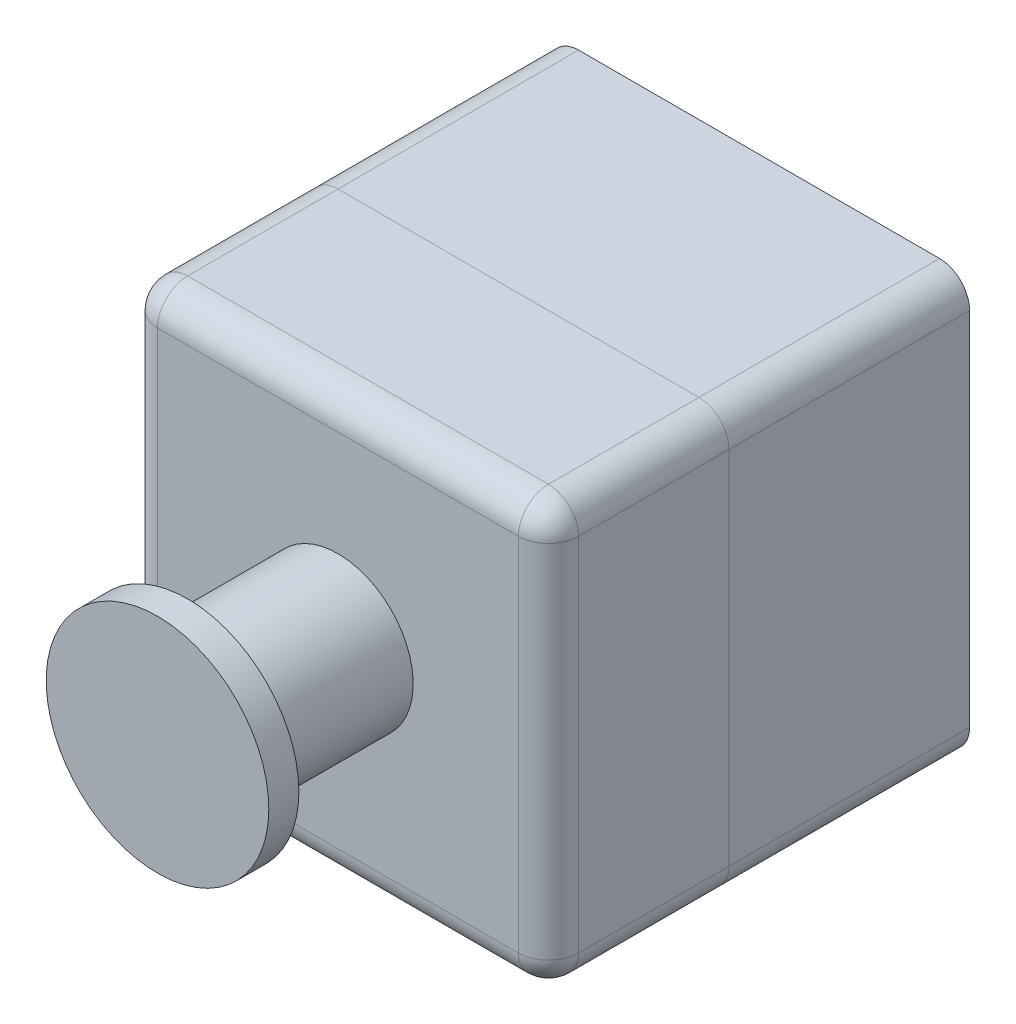
ISO-10303-21;
HEADER;
FILE_DESCRIPTION(('STEP AP214'),'2;1');
FILE_NAME('part.step','',(''),(''),'','','');
FILE_SCHEMA(('AUTOMOTIVE_DESIGN { 1 0 10303 214 1 1 1 1 }'));
ENDSEC;
DATA;
#1=APPLICATION_CONTEXT('core data for automotive mechanical design processes');
#2=APPLICATION_PROTOCOL_DEFINITION('international standard','automotive_design',2000,#1);
#3=PRODUCT_CONTEXT('',#1,'mechanical');
#4=PRODUCT('Part','Part','',(#3));
#5=PRODUCT_RELATED_PRODUCT_CATEGORY('part','',(#4));
#6=PRODUCT_DEFINITION_FORMATION('','',#4);
#7=PRODUCT_DEFINITION_CONTEXT('part definition',#1,'design');
#8=PRODUCT_DEFINITION('design','',#6,#7);
#9=PRODUCT_DEFINITION_SHAPE('','',#8);
#10=(LENGTH_UNIT() NAMED_UNIT(*) SI_UNIT(.MILLI.,.METRE.));
#11=(NAMED_UNIT(*) PLANE_ANGLE_UNIT() SI_UNIT($,.RADIAN.));
#12=(NAMED_UNIT(*) SI_UNIT($,.STERADIAN.) SOLID_ANGLE_UNIT());
#13=UNCERTAINTY_MEASURE_WITH_UNIT(LENGTH_MEASURE(1.E-05),#10,'distance_accuracy_value','');
#14=(GEOMETRIC_REPRESENTATION_CONTEXT(3) GLOBAL_UNCERTAINTY_ASSIGNED_CONTEXT((#13)) GLOBAL_UNIT_ASSIGNED_CONTEXT((#10,
#11,#12)) REPRESENTATION_CONTEXT('',''));
#15=CARTESIAN_POINT('',(0.,0.,0.));
#16=DIRECTION('',(0.,0.,1.));
#17=DIRECTION('',(1.,0.,0.));
#18=AXIS2_PLACEMENT_3D('',#15,#16,#17);
#19=CARTESIAN_POINT('',(35.,-35.,40.));
#20=DIRECTION('',(-1.,0.,0.));
#21=DIRECTION('',(0.,0.,1.));
#22=AXIS2_PLACEMENT_3D('',#19,#20,#21);
#23=PLANE('',#22);
#24=DIRECTION('',(0.,1.,0.));
#25=VECTOR('',#24,1.);
#26=CARTESIAN_POINT('',(35.,-35.,0.));
#27=LINE('',#26,#25);
#28=CARTESIAN_POINT('',(35.,-30.,0.));
#29=VERTEX_POINT('',#28);
#30=CARTESIAN_POINT('',(35.,30.,0.));
#31=VERTEX_POINT('',#30);
#32=EDGE_CURVE('E261',#29,#31,#27,.T.);
#33=ORIENTED_EDGE('',*,*,#32,.T.);
#34=DIRECTION('',(0.,0.,-1.));
#35=VECTOR('',#34,1.);
#36=CARTESIAN_POINT('',(35.,30.,40.));
#37=LINE('',#36,#35);
#38=CARTESIAN_POINT('',(34.9975,29.9975,40.));
#39=VERTEX_POINT('',#38);
#40=EDGE_CURVE('E470',#31,#39,#37,.F.);
#41=ORIENTED_EDGE('',*,*,#40,.T.);
#42=CARTESIAN_POINT('',(34.995,-29.9975,40.));
#43=DIRECTION('',(0.,1.,0.));
#44=VECTOR('',#43,1.);
#45=LINE('',#42,#44);
#46=CARTESIAN_POINT('',(34.9975,-29.9975,40.));
#47=VERTEX_POINT('',#46);
#48=EDGE_CURVE('E231',#47,#39,#45,.T.);
#49=ORIENTED_EDGE('',*,*,#48,.F.);
#50=DIRECTION('',(0.,0.,-1.));
#51=VECTOR('',#50,1.);
#52=CARTESIAN_POINT('',(35.,-30.,40.));
#53=LINE('',#52,#51);
#54=EDGE_CURVE('E432',#47,#29,#53,.T.);
#55=ORIENTED_EDGE('',*,*,#54,.T.);
#56=EDGE_LOOP('',(#33,#41,#49,#55));
#57=FACE_BOUND('',#56,.T.);
#58=ADVANCED_FACE('F35',(#57),#23,.F.);
#59=CARTESIAN_POINT('',(-35.,35.,40.));
#60=DIRECTION('',(0.,-1.,0.));
#61=DIRECTION('',(0.,0.,-1.));
#62=AXIS2_PLACEMENT_3D('',#59,#60,#61);
#63=PLANE('',#62);
#64=DIRECTION('',(-1.,0.,0.));
#65=VECTOR('',#64,1.);
#66=CARTESIAN_POINT('',(-35.,35.,0.));
#67=LINE('',#66,#65);
#68=CARTESIAN_POINT('',(30.,35.,0.));
#69=VERTEX_POINT('',#68);
#70=CARTESIAN_POINT('',(-30.,35.,0.));
#71=VERTEX_POINT('',#70);
#72=EDGE_CURVE('E485',#69,#71,#67,.T.);
#73=ORIENTED_EDGE('',*,*,#72,.T.);
#74=DIRECTION('',(0.,0.,-1.));
#75=VECTOR('',#74,1.);
#76=CARTESIAN_POINT('',(-30.,35.,40.));
#77=LINE('',#76,#75);
#78=CARTESIAN_POINT('',(-29.9975,34.9975,40.));
#79=VERTEX_POINT('',#78);
#80=EDGE_CURVE('E463',#71,#79,#77,.F.);
#81=ORIENTED_EDGE('',*,*,#80,.T.);
#82=CARTESIAN_POINT('',(29.9975,34.995,40.));
#83=DIRECTION('',(-1.,0.,0.));
#84=VECTOR('',#83,1.);
#85=LINE('',#82,#84);
#86=CARTESIAN_POINT('',(29.9975,34.9975,40.));
#87=VERTEX_POINT('',#86);
#88=EDGE_CURVE('E179',#87,#79,#85,.T.);
#89=ORIENTED_EDGE('',*,*,#88,.F.);
#90=DIRECTION('',(0.,0.,-1.));
#91=VECTOR('',#90,1.);
#92=CARTESIAN_POINT('',(30.,35.,40.));
#93=LINE('',#92,#91);
#94=EDGE_CURVE('E58',#87,#69,#93,.T.);
#95=ORIENTED_EDGE('',*,*,#94,.T.);
#96=EDGE_LOOP('',(#73,#81,#89,#95));
#97=FACE_BOUND('',#96,.T.);
#98=ADVANCED_FACE('F204',(#97),#63,.F.);
#99=CARTESIAN_POINT('',(-35.,-35.,40.));
#100=DIRECTION('',(1.,0.,0.));
#101=DIRECTION('',(0.,0.,-1.));
#102=AXIS2_PLACEMENT_3D('',#99,#100,#101);
#103=PLANE('',#102);
#104=CARTESIAN_POINT('',(-34.995,29.9975,40.));
#105=DIRECTION('',(0.,-1.,0.));
#106=VECTOR('',#105,1.);
#107=LINE('',#104,#106);
#108=CARTESIAN_POINT('',(-34.9975,29.9975,40.));
#109=VERTEX_POINT('',#108);
#110=CARTESIAN_POINT('',(-34.9975,-29.9975,40.));
#111=VERTEX_POINT('',#110);
#112=EDGE_CURVE('E166',#109,#111,#107,.T.);
#113=ORIENTED_EDGE('',*,*,#112,.F.);
#114=DIRECTION('',(0.,0.,-1.));
#115=VECTOR('',#114,1.);
#116=CARTESIAN_POINT('',(-35.,30.,40.));
#117=LINE('',#116,#115);
#118=CARTESIAN_POINT('',(-35.,30.,0.));
#119=VERTEX_POINT('',#118);
#120=EDGE_CURVE('E155',#109,#119,#117,.T.);
#121=ORIENTED_EDGE('',*,*,#120,.T.);
#122=DIRECTION('',(0.,-1.,0.));
#123=VECTOR('',#122,1.);
#124=CARTESIAN_POINT('',(-35.,-35.,0.));
#125=LINE('',#124,#123);
#126=CARTESIAN_POINT('',(-35.,-30.,0.));
#127=VERTEX_POINT('',#126);
#128=EDGE_CURVE('E484',#119,#127,#125,.T.);
#129=ORIENTED_EDGE('',*,*,#128,.T.);
#130=DIRECTION('',(0.,0.,-1.));
#131=VECTOR('',#130,1.);
#132=CARTESIAN_POINT('',(-35.,-30.,40.));
#133=LINE('',#132,#131);
#134=EDGE_CURVE('E161',#127,#111,#133,.F.);
#135=ORIENTED_EDGE('',*,*,#134,.T.);
#136=EDGE_LOOP('',(#113,#121,#129,#135));
#137=FACE_BOUND('',#136,.T.);
#138=ADVANCED_FACE('F176',(#137),#103,.F.);
#139=CARTESIAN_POINT('',(-35.,-35.,40.));
#140=DIRECTION('',(0.,1.,0.));
#141=DIRECTION('',(0.,0.,1.));
#142=AXIS2_PLACEMENT_3D('',#139,#140,#141);
#143=PLANE('',#142);
#144=DIRECTION('',(1.,0.,0.));
#145=VECTOR('',#144,1.);
#146=CARTESIAN_POINT('',(-35.,-35.,0.));
#147=LINE('',#146,#145);
#148=CARTESIAN_POINT('',(-30.,-35.,0.));
#149=VERTEX_POINT('',#148);
#150=CARTESIAN_POINT('',(30.,-35.,0.));
#151=VERTEX_POINT('',#150);
#152=EDGE_CURVE('E219',#149,#151,#147,.T.);
#153=ORIENTED_EDGE('',*,*,#152,.T.);
#154=DIRECTION('',(0.,0.,-1.));
#155=VECTOR('',#154,1.);
#156=CARTESIAN_POINT('',(30.,-35.,40.));
#157=LINE('',#156,#155);
#158=CARTESIAN_POINT('',(29.9975,-34.9975,40.));
#159=VERTEX_POINT('',#158);
#160=EDGE_CURVE('E44',#151,#159,#157,.F.);
#161=ORIENTED_EDGE('',*,*,#160,.T.);
#162=CARTESIAN_POINT('',(-29.9975,-34.995,40.));
#163=DIRECTION('',(1.,0.,0.));
#164=VECTOR('',#163,1.);
#165=LINE('',#162,#164);
#166=CARTESIAN_POINT('',(-29.9975,-34.9975,40.));
#167=VERTEX_POINT('',#166);
#168=EDGE_CURVE('E178',#167,#159,#165,.T.);
#169=ORIENTED_EDGE('',*,*,#168,.F.);
#170=DIRECTION('',(0.,0.,-1.));
#171=VECTOR('',#170,1.);
#172=CARTESIAN_POINT('',(-30.,-35.,40.));
#173=LINE('',#172,#171);
#174=EDGE_CURVE('E474',#167,#149,#173,.T.);
#175=ORIENTED_EDGE('',*,*,#174,.T.);
#176=EDGE_LOOP('',(#153,#161,#169,#175));
#177=FACE_BOUND('',#176,.T.);
#178=ADVANCED_FACE('F203',(#177),#143,.F.);
#179=CARTESIAN_POINT('',(0.,0.,0.));
#180=DIRECTION('',(0.,0.,-1.));
#181=DIRECTION('',(-1.,0.,0.));
#182=AXIS2_PLACEMENT_3D('',#179,#180,#181);
#183=PLANE('',#182);
#184=ORIENTED_EDGE('',*,*,#128,.F.);
#185=CARTESIAN_POINT('',(-30.,30.,0.));
#186=DIRECTION('',(0.,0.,-1.));
#187=DIRECTION('',(-1.,0.,0.));
#188=AXIS2_PLACEMENT_3D('',#185,#186,#187);
#189=CIRCLE('',#188,5.);
#190=EDGE_CURVE('E51',#119,#71,#189,.T.);
#191=ORIENTED_EDGE('',*,*,#190,.T.);
#192=ORIENTED_EDGE('',*,*,#72,.F.);
#193=CARTESIAN_POINT('',(30.,30.,0.));
#194=DIRECTION('',(0.,0.,-1.));
#195=DIRECTION('',(-1.,0.,0.));
#196=AXIS2_PLACEMENT_3D('',#193,#194,#195);
#197=CIRCLE('',#196,5.);
#198=EDGE_CURVE('E459',#69,#31,#197,.T.);
#199=ORIENTED_EDGE('',*,*,#198,.T.);
#200=ORIENTED_EDGE('',*,*,#32,.F.);
#201=CARTESIAN_POINT('',(30.,-30.,0.));
#202=DIRECTION('',(0.,0.,-1.));
#203=DIRECTION('',(-1.,0.,0.));
#204=AXIS2_PLACEMENT_3D('',#201,#202,#203);
#205=CIRCLE('',#204,5.);
#206=EDGE_CURVE('E457',#29,#151,#205,.T.);
#207=ORIENTED_EDGE('',*,*,#206,.T.);
#208=ORIENTED_EDGE('',*,*,#152,.F.);
#209=CARTESIAN_POINT('',(-30.,-30.,0.));
#210=DIRECTION('',(0.,0.,-1.));
#211=DIRECTION('',(-1.,0.,0.));
#212=AXIS2_PLACEMENT_3D('',#209,#210,#211);
#213=CIRCLE('',#212,5.);
#214=EDGE_CURVE('E160',#149,#127,#213,.T.);
#215=ORIENTED_EDGE('',*,*,#214,.T.);
#216=EDGE_LOOP('',(#184,#191,#192,#199,#200,#207,#208,#215));
#217=FACE_BOUND('',#216,.T.);
#218=ADVANCED_FACE('F489',(#217),#183,.T.);
#219=CARTESIAN_POINT('',(34.995,-34.995,70.));
#220=DIRECTION('',(-1.,0.,0.));
#221=DIRECTION('',(0.,0.,1.));
#222=AXIS2_PLACEMENT_3D('',#219,#220,#221);
#223=PLANE('',#222);
#224=ORIENTED_EDGE('',*,*,#48,.T.);
#225=DIRECTION('',(0.,0.,-1.));
#226=VECTOR('',#225,1.);
#227=CARTESIAN_POINT('',(34.995,29.995,70.));
#228=LINE('',#227,#226);
#229=CARTESIAN_POINT('',(34.995,29.995,65.));
#230=VERTEX_POINT('',#229);
#231=EDGE_CURVE('E239',#39,#230,#228,.F.);
#232=ORIENTED_EDGE('',*,*,#231,.T.);
#233=DIRECTION('',(0.,1.,0.));
#234=VECTOR('',#233,1.);
#235=CARTESIAN_POINT('',(34.995,-34.995,65.));
#236=LINE('',#235,#234);
#237=CARTESIAN_POINT('',(34.995,-29.995,65.));
#238=VERTEX_POINT('',#237);
#239=EDGE_CURVE('E235',#230,#238,#236,.F.);
#240=ORIENTED_EDGE('',*,*,#239,.T.);
#241=DIRECTION('',(0.,0.,-1.));
#242=VECTOR('',#241,1.);
#243=CARTESIAN_POINT('',(34.995,-29.995,70.));
#244=LINE('',#243,#242);
#245=EDGE_CURVE('E237',#238,#47,#244,.T.);
#246=ORIENTED_EDGE('',*,*,#245,.T.);
#247=EDGE_LOOP('',(#224,#232,#240,#246));
#248=FACE_BOUND('',#247,.T.);
#249=ADVANCED_FACE('F281',(#248),#223,.F.);
#250=CARTESIAN_POINT('',(-34.995,34.995,70.));
#251=DIRECTION('',(0.,-1.,0.));
#252=DIRECTION('',(0.,0.,-1.));
#253=AXIS2_PLACEMENT_3D('',#250,#251,#252);
#254=PLANE('',#253);
#255=ORIENTED_EDGE('',*,*,#88,.T.);
#256=DIRECTION('',(0.,0.,-1.));
#257=VECTOR('',#256,1.);
#258=CARTESIAN_POINT('',(-29.995,34.995,70.));
#259=LINE('',#258,#257);
#260=CARTESIAN_POINT('',(-29.995,34.995,65.));
#261=VERTEX_POINT('',#260);
#262=EDGE_CURVE('E147',#79,#261,#259,.F.);
#263=ORIENTED_EDGE('',*,*,#262,.T.);
#264=DIRECTION('',(-1.,0.,0.));
#265=VECTOR('',#264,1.);
#266=CARTESIAN_POINT('',(-34.995,34.995,65.));
#267=LINE('',#266,#265);
#268=CARTESIAN_POINT('',(29.995,34.995,65.));
#269=VERTEX_POINT('',#268);
#270=EDGE_CURVE('E172',#261,#269,#267,.F.);
#271=ORIENTED_EDGE('',*,*,#270,.T.);
#272=DIRECTION('',(0.,0.,-1.));
#273=VECTOR('',#272,1.);
#274=CARTESIAN_POINT('',(29.995,34.995,70.));
#275=LINE('',#274,#273);
#276=EDGE_CURVE('E301',#269,#87,#275,.T.);
#277=ORIENTED_EDGE('',*,*,#276,.T.);
#278=EDGE_LOOP('',(#255,#263,#271,#277));
#279=FACE_BOUND('',#278,.T.);
#280=ADVANCED_FACE('F277',(#279),#254,.F.);
#281=CARTESIAN_POINT('',(-34.995,-34.995,70.));
#282=DIRECTION('',(1.,0.,0.));
#283=DIRECTION('',(0.,0.,-1.));
#284=AXIS2_PLACEMENT_3D('',#281,#282,#283);
#285=PLANE('',#284);
#286=DIRECTION('',(0.,-1.,0.));
#287=VECTOR('',#286,1.);
#288=CARTESIAN_POINT('',(-34.995,-34.995,65.));
#289=LINE('',#288,#287);
#290=CARTESIAN_POINT('',(-34.995,-29.995,65.));
#291=VERTEX_POINT('',#290);
#292=CARTESIAN_POINT('',(-34.995,29.995,65.));
#293=VERTEX_POINT('',#292);
#294=EDGE_CURVE('E170',#291,#293,#289,.F.);
#295=ORIENTED_EDGE('',*,*,#294,.T.);
#296=DIRECTION('',(0.,0.,-1.));
#297=VECTOR('',#296,1.);
#298=CARTESIAN_POINT('',(-34.995,29.995,70.));
#299=LINE('',#298,#297);
#300=EDGE_CURVE('E146',#293,#109,#299,.T.);
#301=ORIENTED_EDGE('',*,*,#300,.T.);
#302=ORIENTED_EDGE('',*,*,#112,.T.);
#303=DIRECTION('',(0.,0.,-1.));
#304=VECTOR('',#303,1.);
#305=CARTESIAN_POINT('',(-34.995,-29.995,70.));
#306=LINE('',#305,#304);
#307=EDGE_CURVE('E173',#111,#291,#306,.F.);
#308=ORIENTED_EDGE('',*,*,#307,.T.);
#309=EDGE_LOOP('',(#295,#301,#302,#308));
#310=FACE_BOUND('',#309,.T.);
#311=ADVANCED_FACE('F165',(#310),#285,.F.);
#312=CARTESIAN_POINT('',(-34.995,-34.995,70.));
#313=DIRECTION('',(0.,1.,0.));
#314=DIRECTION('',(0.,0.,1.));
#315=AXIS2_PLACEMENT_3D('',#312,#313,#314);
#316=PLANE('',#315);
#317=ORIENTED_EDGE('',*,*,#168,.T.);
#318=DIRECTION('',(0.,0.,-1.));
#319=VECTOR('',#318,1.);
#320=CARTESIAN_POINT('',(29.995,-34.995,70.));
#321=LINE('',#320,#319);
#322=CARTESIAN_POINT('',(29.995,-34.995,65.));
#323=VERTEX_POINT('',#322);
#324=EDGE_CURVE('E433',#159,#323,#321,.F.);
#325=ORIENTED_EDGE('',*,*,#324,.T.);
#326=DIRECTION('',(1.,0.,0.));
#327=VECTOR('',#326,1.);
#328=CARTESIAN_POINT('',(-34.995,-34.995,65.));
#329=LINE('',#328,#327);
#330=CARTESIAN_POINT('',(-29.995,-34.995,65.));
#331=VERTEX_POINT('',#330);
#332=EDGE_CURVE('E243',#323,#331,#329,.F.);
#333=ORIENTED_EDGE('',*,*,#332,.T.);
#334=DIRECTION('',(0.,0.,-1.));
#335=VECTOR('',#334,1.);
#336=CARTESIAN_POINT('',(-29.995,-34.995,70.));
#337=LINE('',#336,#335);
#338=EDGE_CURVE('E435',#331,#167,#337,.T.);
#339=ORIENTED_EDGE('',*,*,#338,.T.);
#340=EDGE_LOOP('',(#317,#325,#333,#339));
#341=FACE_BOUND('',#340,.T.);
#342=ADVANCED_FACE('F263',(#341),#316,.F.);
#343=CARTESIAN_POINT('',(0.,0.,70.));
#344=DIRECTION('',(0.,0.,-1.));
#345=DIRECTION('',(-1.,0.,0.));
#346=AXIS2_PLACEMENT_3D('',#343,#344,#345);
#347=PLANE('',#346);
#348=CARTESIAN_POINT('',(0.,0.,70.));
#349=DIRECTION('',(0.,0.,-1.));
#350=DIRECTION('',(-1.,0.,0.));
#351=AXIS2_PLACEMENT_3D('',#348,#349,#350);
#352=CIRCLE('',#351,12.5);
#353=CARTESIAN_POINT('',(-12.5,0.,70.));
#354=VERTEX_POINT('',#353);
#355=EDGE_CURVE('E11',#354,#354,#352,.F.);
#356=ORIENTED_EDGE('',*,*,#355,.F.);
#357=EDGE_LOOP('',(#356));
#358=FACE_BOUND('',#357,.T.);
#359=DIRECTION('',(1.,0.,0.));
#360=VECTOR('',#359,1.);
#361=CARTESIAN_POINT('',(0.,-29.995,70.));
#362=LINE('',#361,#360);
#363=CARTESIAN_POINT('',(-29.995,-29.995,70.));
#364=VERTEX_POINT('',#363);
#365=CARTESIAN_POINT('',(29.995,-29.995,70.));
#366=VERTEX_POINT('',#365);
#367=EDGE_CURVE('E446',#364,#366,#362,.T.);
#368=ORIENTED_EDGE('',*,*,#367,.T.);
#369=DIRECTION('',(0.,1.,0.));
#370=VECTOR('',#369,1.);
#371=CARTESIAN_POINT('',(29.995,0.,70.));
#372=LINE('',#371,#370);
#373=CARTESIAN_POINT('',(29.995,29.995,70.));
#374=VERTEX_POINT('',#373);
#375=EDGE_CURVE('E448',#366,#374,#372,.T.);
#376=ORIENTED_EDGE('',*,*,#375,.T.);
#377=DIRECTION('',(-1.,0.,0.));
#378=VECTOR('',#377,1.);
#379=CARTESIAN_POINT('',(0.,29.995,70.));
#380=LINE('',#379,#378);
#381=CARTESIAN_POINT('',(-29.995,29.995,70.));
#382=VERTEX_POINT('',#381);
#383=EDGE_CURVE('E437',#374,#382,#380,.T.);
#384=ORIENTED_EDGE('',*,*,#383,.T.);
#385=DIRECTION('',(0.,-1.,0.));
#386=VECTOR('',#385,1.);
#387=CARTESIAN_POINT('',(-29.995,0.,70.));
#388=LINE('',#387,#386);
#389=EDGE_CURVE('E434',#382,#364,#388,.T.);
#390=ORIENTED_EDGE('',*,*,#389,.T.);
#391=EDGE_LOOP('',(#368,#376,#384,#390));
#392=FACE_BOUND('',#391,.T.);
#393=ADVANCED_FACE('F272',(#358,#392),#347,.F.);
#394=CARTESIAN_POINT('',(30.,-30.,40.));
#395=DIRECTION('',(0.,0.,-1.));
#396=DIRECTION('',(-1.,0.,0.));
#397=AXIS2_PLACEMENT_3D('',#394,#395,#396);
#398=CYLINDRICAL_SURFACE('',#397,5.);
#399=ORIENTED_EDGE('',*,*,#206,.F.);
#400=ORIENTED_EDGE('',*,*,#54,.F.);
#401=CARTESIAN_POINT('',(29.995,-29.995,40.));
#402=DIRECTION('',(0.,0.,1.));
#403=DIRECTION('',(0.,-1.,0.));
#404=AXIS2_PLACEMENT_3D('',#401,#402,#403);
#405=CIRCLE('',#404,5.);
#406=EDGE_CURVE('E353',#159,#47,#405,.T.);
#407=ORIENTED_EDGE('',*,*,#406,.F.);
#408=ORIENTED_EDGE('',*,*,#160,.F.);
#409=EDGE_LOOP('',(#399,#400,#407,#408));
#410=FACE_BOUND('',#409,.T.);
#411=ADVANCED_FACE('F37',(#410),#398,.T.);
#412=CARTESIAN_POINT('',(29.995,-29.995,70.));
#413=DIRECTION('',(0.,0.,-1.));
#414=DIRECTION('',(-1.,0.,0.));
#415=AXIS2_PLACEMENT_3D('',#412,#413,#414);
#416=CYLINDRICAL_SURFACE('',#415,5.);
#417=ORIENTED_EDGE('',*,*,#406,.T.);
#418=ORIENTED_EDGE('',*,*,#245,.F.);
#419=CARTESIAN_POINT('',(29.995,-29.995,65.));
#420=DIRECTION('',(0.,0.,1.));
#421=DIRECTION('',(1.,0.,0.));
#422=AXIS2_PLACEMENT_3D('',#419,#420,#421);
#423=CIRCLE('',#422,5.);
#424=EDGE_CURVE('E351',#323,#238,#423,.T.);
#425=ORIENTED_EDGE('',*,*,#424,.F.);
#426=ORIENTED_EDGE('',*,*,#324,.F.);
#427=EDGE_LOOP('',(#417,#418,#425,#426));
#428=FACE_BOUND('',#427,.T.);
#429=ADVANCED_FACE('F400',(#428),#416,.T.);
#430=CARTESIAN_POINT('',(30.,30.,40.));
#431=DIRECTION('',(0.,0.,-1.));
#432=DIRECTION('',(-1.,0.,0.));
#433=AXIS2_PLACEMENT_3D('',#430,#431,#432);
#434=CYLINDRICAL_SURFACE('',#433,5.);
#435=ORIENTED_EDGE('',*,*,#198,.F.);
#436=ORIENTED_EDGE('',*,*,#94,.F.);
#437=CARTESIAN_POINT('',(29.995,29.995,40.));
#438=DIRECTION('',(0.,0.,1.));
#439=DIRECTION('',(1.,0.,0.));
#440=AXIS2_PLACEMENT_3D('',#437,#438,#439);
#441=CIRCLE('',#440,5.);
#442=EDGE_CURVE('E350',#39,#87,#441,.T.);
#443=ORIENTED_EDGE('',*,*,#442,.F.);
#444=ORIENTED_EDGE('',*,*,#40,.F.);
#445=EDGE_LOOP('',(#435,#436,#443,#444));
#446=FACE_BOUND('',#445,.T.);
#447=ADVANCED_FACE('F397',(#446),#434,.T.);
#448=CARTESIAN_POINT('',(29.995,-29.995,65.));
#449=DIRECTION('',(1.,0.,0.));
#450=DIRECTION('',(0.,0.,-1.));
#451=AXIS2_PLACEMENT_3D('',#448,#449,#450);
#452=SPHERICAL_SURFACE('',#451,5.);
#453=CARTESIAN_POINT('',(29.995,-29.995,65.));
#454=DIRECTION('',(1.,0.,0.));
#455=DIRECTION('',(0.,0.,-1.));
#456=AXIS2_PLACEMENT_3D('',#453,#454,#455);
#457=CIRCLE('',#456,5.);
#458=EDGE_CURVE('E345',#323,#366,#457,.F.);
#459=ORIENTED_EDGE('',*,*,#458,.F.);
#460=ORIENTED_EDGE('',*,*,#424,.T.);
#461=CARTESIAN_POINT('',(29.995,-29.995,65.));
#462=DIRECTION('',(0.,-1.,0.));
#463=DIRECTION('',(0.,0.,-1.));
#464=AXIS2_PLACEMENT_3D('',#461,#462,#463);
#465=CIRCLE('',#464,5.);
#466=EDGE_CURVE('E348',#366,#238,#465,.F.);
#467=ORIENTED_EDGE('',*,*,#466,.F.);
#468=EDGE_LOOP('',(#459,#460,#467));
#469=FACE_BOUND('',#468,.T.);
#470=ADVANCED_FACE('F393',(#469),#452,.T.);
#471=CARTESIAN_POINT('',(-30.,-30.,40.));
#472=DIRECTION('',(0.,0.,-1.));
#473=DIRECTION('',(-1.,0.,0.));
#474=AXIS2_PLACEMENT_3D('',#471,#472,#473);
#475=CYLINDRICAL_SURFACE('',#474,5.);
#476=ORIENTED_EDGE('',*,*,#214,.F.);
#477=ORIENTED_EDGE('',*,*,#174,.F.);
#478=CARTESIAN_POINT('',(-29.995,-29.995,40.));
#479=DIRECTION('',(0.,0.,1.));
#480=DIRECTION('',(-1.,0.,0.));
#481=AXIS2_PLACEMENT_3D('',#478,#479,#480);
#482=CIRCLE('',#481,5.);
#483=EDGE_CURVE('E344',#111,#167,#482,.T.);
#484=ORIENTED_EDGE('',*,*,#483,.F.);
#485=ORIENTED_EDGE('',*,*,#134,.F.);
#486=EDGE_LOOP('',(#476,#477,#484,#485));
#487=FACE_BOUND('',#486,.T.);
#488=ADVANCED_FACE('F388',(#487),#475,.T.);
#489=CARTESIAN_POINT('',(29.995,29.995,70.));
#490=DIRECTION('',(0.,0.,-1.));
#491=DIRECTION('',(-1.,0.,0.));
#492=AXIS2_PLACEMENT_3D('',#489,#490,#491);
#493=CYLINDRICAL_SURFACE('',#492,5.);
#494=ORIENTED_EDGE('',*,*,#442,.T.);
#495=ORIENTED_EDGE('',*,*,#276,.F.);
#496=CARTESIAN_POINT('',(29.995,29.995,65.));
#497=DIRECTION('',(0.,0.,1.));
#498=DIRECTION('',(1.,0.,0.));
#499=AXIS2_PLACEMENT_3D('',#496,#497,#498);
#500=CIRCLE('',#499,5.);
#501=EDGE_CURVE('E341',#230,#269,#500,.T.);
#502=ORIENTED_EDGE('',*,*,#501,.F.);
#503=ORIENTED_EDGE('',*,*,#231,.F.);
#504=EDGE_LOOP('',(#494,#495,#502,#503));
#505=FACE_BOUND('',#504,.T.);
#506=ADVANCED_FACE('F364',(#505),#493,.T.);
#507=CARTESIAN_POINT('',(29.995,0.,65.));
#508=DIRECTION('',(0.,1.,0.));
#509=DIRECTION('',(0.,0.,1.));
#510=AXIS2_PLACEMENT_3D('',#507,#508,#509);
#511=CYLINDRICAL_SURFACE('',#510,5.);
#512=ORIENTED_EDGE('',*,*,#466,.T.);
#513=ORIENTED_EDGE('',*,*,#239,.F.);
#514=CARTESIAN_POINT('',(29.995,29.995,65.));
#515=DIRECTION('',(0.,1.,0.));
#516=DIRECTION('',(0.,0.,1.));
#517=AXIS2_PLACEMENT_3D('',#514,#515,#516);
#518=CIRCLE('',#517,5.);
#519=EDGE_CURVE('E338',#374,#230,#518,.T.);
#520=ORIENTED_EDGE('',*,*,#519,.F.);
#521=ORIENTED_EDGE('',*,*,#375,.F.);
#522=EDGE_LOOP('',(#512,#513,#520,#521));
#523=FACE_BOUND('',#522,.T.);
#524=ADVANCED_FACE('F387',(#523),#511,.T.);
#525=CARTESIAN_POINT('',(0.,-29.995,65.));
#526=DIRECTION('',(1.,0.,0.));
#527=DIRECTION('',(0.,0.,-1.));
#528=AXIS2_PLACEMENT_3D('',#525,#526,#527);
#529=CYLINDRICAL_SURFACE('',#528,5.);
#530=ORIENTED_EDGE('',*,*,#458,.T.);
#531=ORIENTED_EDGE('',*,*,#367,.F.);
#532=CARTESIAN_POINT('',(-29.995,-29.995,65.));
#533=DIRECTION('',(-1.,0.,0.));
#534=DIRECTION('',(0.,0.,1.));
#535=AXIS2_PLACEMENT_3D('',#532,#533,#534);
#536=CIRCLE('',#535,5.);
#537=EDGE_CURVE('E335',#331,#364,#536,.T.);
#538=ORIENTED_EDGE('',*,*,#537,.F.);
#539=ORIENTED_EDGE('',*,*,#332,.F.);
#540=EDGE_LOOP('',(#530,#531,#538,#539));
#541=FACE_BOUND('',#540,.T.);
#542=ADVANCED_FACE('F599',(#541),#529,.T.);
#543=CARTESIAN_POINT('',(-29.995,-29.995,70.));
#544=DIRECTION('',(0.,0.,-1.));
#545=DIRECTION('',(-1.,0.,0.));
#546=AXIS2_PLACEMENT_3D('',#543,#544,#545);
#547=CYLINDRICAL_SURFACE('',#546,5.);
#548=ORIENTED_EDGE('',*,*,#483,.T.);
#549=ORIENTED_EDGE('',*,*,#338,.F.);
#550=CARTESIAN_POINT('',(-29.995,-29.995,65.));
#551=DIRECTION('',(0.,0.,1.));
#552=DIRECTION('',(1.,0.,0.));
#553=AXIS2_PLACEMENT_3D('',#550,#551,#552);
#554=CIRCLE('',#553,5.);
#555=EDGE_CURVE('E332',#291,#331,#554,.T.);
#556=ORIENTED_EDGE('',*,*,#555,.F.);
#557=ORIENTED_EDGE('',*,*,#307,.F.);
#558=EDGE_LOOP('',(#548,#549,#556,#557));
#559=FACE_BOUND('',#558,.T.);
#560=ADVANCED_FACE('F608',(#559),#547,.T.);
#561=CARTESIAN_POINT('',(29.995,29.995,65.));
#562=DIRECTION('',(1.,0.,0.));
#563=DIRECTION('',(0.,0.,-1.));
#564=AXIS2_PLACEMENT_3D('',#561,#562,#563);
#565=SPHERICAL_SURFACE('',#564,5.);
#566=ORIENTED_EDGE('',*,*,#519,.T.);
#567=ORIENTED_EDGE('',*,*,#501,.T.);
#568=CARTESIAN_POINT('',(29.995,29.995,65.));
#569=DIRECTION('',(1.,0.,0.));
#570=DIRECTION('',(0.,0.,-1.));
#571=AXIS2_PLACEMENT_3D('',#568,#569,#570);
#572=CIRCLE('',#571,5.);
#573=EDGE_CURVE('E316',#374,#269,#572,.F.);
#574=ORIENTED_EDGE('',*,*,#573,.F.);
#575=EDGE_LOOP('',(#566,#567,#574));
#576=FACE_BOUND('',#575,.T.);
#577=ADVANCED_FACE('F617',(#576),#565,.T.);
#578=CARTESIAN_POINT('',(-29.995,-29.995,65.));
#579=DIRECTION('',(0.,-1.,0.));
#580=DIRECTION('',(0.,0.,-1.));
#581=AXIS2_PLACEMENT_3D('',#578,#579,#580);
#582=SPHERICAL_SURFACE('',#581,5.);
#583=ORIENTED_EDGE('',*,*,#555,.T.);
#584=ORIENTED_EDGE('',*,*,#537,.T.);
#585=CARTESIAN_POINT('',(-29.995,-29.995,65.));
#586=DIRECTION('',(0.,-1.,0.));
#587=DIRECTION('',(0.,0.,-1.));
#588=AXIS2_PLACEMENT_3D('',#585,#586,#587);
#589=CIRCLE('',#588,5.);
#590=EDGE_CURVE('E321',#291,#364,#589,.F.);
#591=ORIENTED_EDGE('',*,*,#590,.F.);
#592=EDGE_LOOP('',(#583,#584,#591));
#593=FACE_BOUND('',#592,.T.);
#594=ADVANCED_FACE('F627',(#593),#582,.T.);
#595=CARTESIAN_POINT('',(0.,29.995,65.));
#596=DIRECTION('',(-1.,0.,0.));
#597=DIRECTION('',(0.,0.,1.));
#598=AXIS2_PLACEMENT_3D('',#595,#596,#597);
#599=CYLINDRICAL_SURFACE('',#598,5.);
#600=ORIENTED_EDGE('',*,*,#573,.T.);
#601=ORIENTED_EDGE('',*,*,#270,.F.);
#602=CARTESIAN_POINT('',(-29.995,29.995,65.));
#603=DIRECTION('',(-1.,0.,0.));
#604=DIRECTION('',(0.,0.,1.));
#605=AXIS2_PLACEMENT_3D('',#602,#603,#604);
#606=CIRCLE('',#605,5.);
#607=EDGE_CURVE('E313',#382,#261,#606,.T.);
#608=ORIENTED_EDGE('',*,*,#607,.F.);
#609=ORIENTED_EDGE('',*,*,#383,.F.);
#610=EDGE_LOOP('',(#600,#601,#608,#609));
#611=FACE_BOUND('',#610,.T.);
#612=ADVANCED_FACE('F312',(#611),#599,.T.);
#613=CARTESIAN_POINT('',(-29.995,0.,65.));
#614=DIRECTION('',(0.,-1.,0.));
#615=DIRECTION('',(0.,0.,-1.));
#616=AXIS2_PLACEMENT_3D('',#613,#614,#615);
#617=CYLINDRICAL_SURFACE('',#616,5.);
#618=ORIENTED_EDGE('',*,*,#590,.T.);
#619=ORIENTED_EDGE('',*,*,#389,.F.);
#620=CARTESIAN_POINT('',(-29.995,29.995,65.));
#621=DIRECTION('',(0.,1.,0.));
#622=DIRECTION('',(0.,0.,1.));
#623=AXIS2_PLACEMENT_3D('',#620,#621,#622);
#624=CIRCLE('',#623,5.);
#625=EDGE_CURVE('E320',#293,#382,#624,.T.);
#626=ORIENTED_EDGE('',*,*,#625,.F.);
#627=ORIENTED_EDGE('',*,*,#294,.F.);
#628=EDGE_LOOP('',(#618,#619,#626,#627));
#629=FACE_BOUND('',#628,.T.);
#630=ADVANCED_FACE('F646',(#629),#617,.T.);
#631=CARTESIAN_POINT('',(-29.995,29.995,65.));
#632=DIRECTION('',(0.,0.,1.));
#633=DIRECTION('',(1.,0.,0.));
#634=AXIS2_PLACEMENT_3D('',#631,#632,#633);
#635=SPHERICAL_SURFACE('',#634,5.);
#636=ORIENTED_EDGE('',*,*,#625,.T.);
#637=ORIENTED_EDGE('',*,*,#607,.T.);
#638=CARTESIAN_POINT('',(-29.995,29.995,65.));
#639=DIRECTION('',(0.,0.,1.));
#640=DIRECTION('',(1.,0.,0.));
#641=AXIS2_PLACEMENT_3D('',#638,#639,#640);
#642=CIRCLE('',#641,5.);
#643=EDGE_CURVE('E151',#293,#261,#642,.F.);
#644=ORIENTED_EDGE('',*,*,#643,.F.);
#645=EDGE_LOOP('',(#636,#637,#644));
#646=FACE_BOUND('',#645,.T.);
#647=ADVANCED_FACE('F319',(#646),#635,.T.);
#648=CARTESIAN_POINT('',(-30.,30.,40.));
#649=DIRECTION('',(0.,0.,-1.));
#650=DIRECTION('',(-1.,0.,0.));
#651=AXIS2_PLACEMENT_3D('',#648,#649,#650);
#652=CYLINDRICAL_SURFACE('',#651,5.);
#653=ORIENTED_EDGE('',*,*,#190,.F.);
#654=ORIENTED_EDGE('',*,*,#120,.F.);
#655=CARTESIAN_POINT('',(-29.995,29.995,40.));
#656=DIRECTION('',(0.,0.,1.));
#657=DIRECTION('',(0.,1.,0.));
#658=AXIS2_PLACEMENT_3D('',#655,#656,#657);
#659=CIRCLE('',#658,5.);
#660=EDGE_CURVE('E140',#79,#109,#659,.T.);
#661=ORIENTED_EDGE('',*,*,#660,.F.);
#662=ORIENTED_EDGE('',*,*,#80,.F.);
#663=EDGE_LOOP('',(#653,#654,#661,#662));
#664=FACE_BOUND('',#663,.T.);
#665=ADVANCED_FACE('F156',(#664),#652,.T.);
#666=CARTESIAN_POINT('',(-29.995,29.995,70.));
#667=DIRECTION('',(0.,0.,-1.));
#668=DIRECTION('',(-1.,0.,0.));
#669=AXIS2_PLACEMENT_3D('',#666,#667,#668);
#670=CYLINDRICAL_SURFACE('',#669,5.);
#671=ORIENTED_EDGE('',*,*,#643,.T.);
#672=ORIENTED_EDGE('',*,*,#262,.F.);
#673=ORIENTED_EDGE('',*,*,#660,.T.);
#674=ORIENTED_EDGE('',*,*,#300,.F.);
#675=EDGE_LOOP('',(#671,#672,#673,#674));
#676=FACE_BOUND('',#675,.T.);
#677=ADVANCED_FACE('F144',(#676),#670,.T.);
#678=CARTESIAN_POINT('',(0.,0.,95.));
#679=DIRECTION('',(0.,0.,-1.));
#680=DIRECTION('',(-1.,0.,0.));
#681=AXIS2_PLACEMENT_3D('',#678,#679,#680);
#682=CYLINDRICAL_SURFACE('',#681,12.5);
#683=CARTESIAN_POINT('',(0.,0.,95.));
#684=DIRECTION('',(0.,0.,1.));
#685=DIRECTION('',(1.,0.,0.));
#686=AXIS2_PLACEMENT_3D('',#683,#684,#685);
#687=CIRCLE('',#686,12.5);
#688=CARTESIAN_POINT('',(12.5,0.,95.));
#689=VERTEX_POINT('',#688);
#690=EDGE_CURVE('E152',#689,#689,#687,.T.);
#691=ORIENTED_EDGE('',*,*,#690,.F.);
#692=EDGE_LOOP('',(#691));
#693=FACE_BOUND('',#692,.T.);
#694=ORIENTED_EDGE('',*,*,#355,.T.);
#695=EDGE_LOOP('',(#694));
#696=FACE_BOUND('',#695,.T.);
#697=ADVANCED_FACE('F677',(#693,#696),#682,.T.);
#698=CARTESIAN_POINT('',(0.,0.,100.));
#699=DIRECTION('',(0.,0.,-1.));
#700=DIRECTION('',(-1.,0.,0.));
#701=AXIS2_PLACEMENT_3D('',#698,#699,#700);
#702=CYLINDRICAL_SURFACE('',#701,18.5);
#703=CARTESIAN_POINT('',(0.,0.,100.));
#704=DIRECTION('',(0.,0.,1.));
#705=DIRECTION('',(1.,0.,0.));
#706=AXIS2_PLACEMENT_3D('',#703,#704,#705);
#707=CIRCLE('',#706,18.5);
#708=CARTESIAN_POINT('',(18.5,0.,100.));
#709=VERTEX_POINT('',#708);
#710=EDGE_CURVE('E769',#709,#709,#707,.T.);
#711=ORIENTED_EDGE('',*,*,#710,.F.);
#712=EDGE_LOOP('',(#711));
#713=FACE_BOUND('',#712,.T.);
#714=CARTESIAN_POINT('',(0.,0.,95.));
#715=DIRECTION('',(0.,0.,1.));
#716=DIRECTION('',(1.,0.,0.));
#717=AXIS2_PLACEMENT_3D('',#714,#715,#716);
#718=CIRCLE('',#717,18.5);
#719=CARTESIAN_POINT('',(18.5,0.,95.));
#720=VERTEX_POINT('',#719);
#721=EDGE_CURVE('E767',#720,#720,#718,.T.);
#722=ORIENTED_EDGE('',*,*,#721,.T.);
#723=EDGE_LOOP('',(#722));
#724=FACE_BOUND('',#723,.T.);
#725=ADVANCED_FACE('F684',(#713,#724),#702,.T.);
#726=CARTESIAN_POINT('',(0.,0.,100.));
#727=DIRECTION('',(0.,0.,1.));
#728=DIRECTION('',(1.,0.,0.));
#729=AXIS2_PLACEMENT_3D('',#726,#727,#728);
#730=PLANE('',#729);
#731=ORIENTED_EDGE('',*,*,#710,.T.);
#732=EDGE_LOOP('',(#731));
#733=FACE_BOUND('',#732,.T.);
#734=ADVANCED_FACE('F693',(#733),#730,.T.);
#735=CARTESIAN_POINT('',(0.,0.,95.));
#736=DIRECTION('',(0.,0.,1.));
#737=DIRECTION('',(1.,0.,0.));
#738=AXIS2_PLACEMENT_3D('',#735,#736,#737);
#739=PLANE('',#738);
#740=ORIENTED_EDGE('',*,*,#690,.T.);
#741=EDGE_LOOP('',(#740));
#742=FACE_BOUND('',#741,.T.);
#743=ORIENTED_EDGE('',*,*,#721,.F.);
#744=EDGE_LOOP('',(#743));
#745=FACE_BOUND('',#744,.T.);
#746=ADVANCED_FACE('F703',(#742,#745),#739,.F.);
#747=CLOSED_SHELL('',(#58,#98,#138,#178,#218,#249,#280,#311,#342,#393,#411,#429,#447,#470,#488,
#506,#524,#542,#560,#577,#594,#612,#630,#647,#665,#677,#697,#725,#734,#746));
#748=MANIFOLD_SOLID_BREP('B2',#747);
#749=ADVANCED_BREP_SHAPE_REPRESENTATION('',(#18,#748),#14);
#750=SHAPE_DEFINITION_REPRESENTATION(#9,#749);
ENDSEC;
END-ISO-10303-21;
